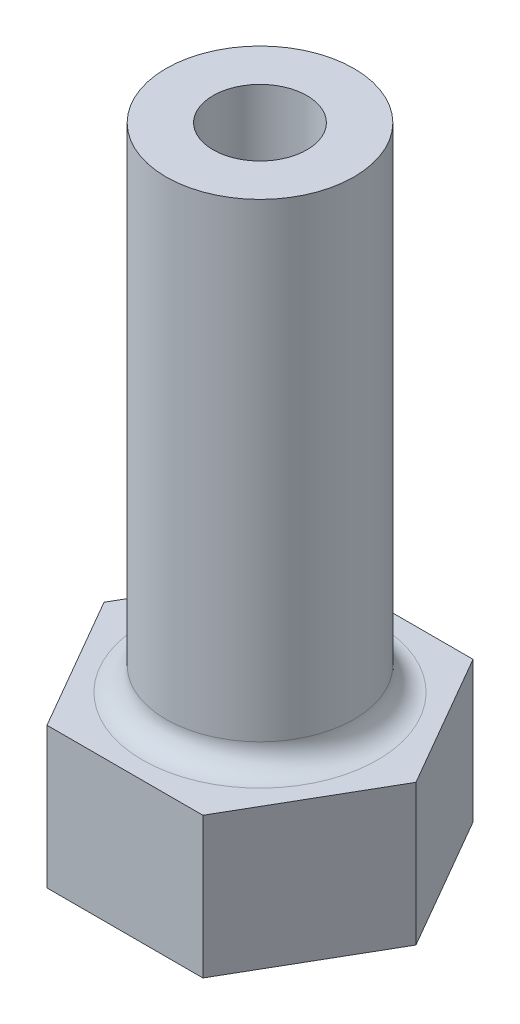
ISO-10303-21;
HEADER;
FILE_DESCRIPTION(('STEP AP214'),'2;1');
FILE_NAME('part.step','',(''),(''),'','','');
FILE_SCHEMA(('AUTOMOTIVE_DESIGN { 1 0 10303 214 1 1 1 1 }'));
ENDSEC;
DATA;
#1=APPLICATION_CONTEXT('core data for automotive mechanical design processes');
#2=APPLICATION_PROTOCOL_DEFINITION('international standard','automotive_design',2000,#1);
#3=PRODUCT_CONTEXT('',#1,'mechanical');
#4=PRODUCT('Part','Part','',(#3));
#5=PRODUCT_RELATED_PRODUCT_CATEGORY('part','',(#4));
#6=PRODUCT_DEFINITION_FORMATION('','',#4);
#7=PRODUCT_DEFINITION_CONTEXT('part definition',#1,'design');
#8=PRODUCT_DEFINITION('design','',#6,#7);
#9=PRODUCT_DEFINITION_SHAPE('','',#8);
#10=(LENGTH_UNIT() NAMED_UNIT(*) SI_UNIT(.MILLI.,.METRE.));
#11=(NAMED_UNIT(*) PLANE_ANGLE_UNIT() SI_UNIT($,.RADIAN.));
#12=(NAMED_UNIT(*) SI_UNIT($,.STERADIAN.) SOLID_ANGLE_UNIT());
#13=UNCERTAINTY_MEASURE_WITH_UNIT(LENGTH_MEASURE(1.E-05),#10,'distance_accuracy_value','');
#14=(GEOMETRIC_REPRESENTATION_CONTEXT(3) GLOBAL_UNCERTAINTY_ASSIGNED_CONTEXT((#13)) GLOBAL_UNIT_ASSIGNED_CONTEXT((#10,
#11,#12)) REPRESENTATION_CONTEXT('',''));
#15=CARTESIAN_POINT('',(0.,0.,0.));
#16=DIRECTION('',(0.,0.,1.));
#17=DIRECTION('',(1.,0.,0.));
#18=AXIS2_PLACEMENT_3D('',#15,#16,#17);
#19=CARTESIAN_POINT('',(0.,27.,0.));
#20=DIRECTION('',(0.,-1.,0.));
#21=DIRECTION('',(0.,0.,-1.));
#22=AXIS2_PLACEMENT_3D('',#19,#20,#21);
#23=CYLINDRICAL_SURFACE('',#22,4.);
#24=CARTESIAN_POINT('',(0.,7.,0.));
#25=DIRECTION('',(0.,1.,0.));
#26=DIRECTION('',(0.,0.,1.));
#27=AXIS2_PLACEMENT_3D('',#24,#25,#26);
#28=CIRCLE('',#27,4.);
#29=CARTESIAN_POINT('',(0.,7.,4.));
#30=VERTEX_POINT('',#29);
#31=EDGE_CURVE('E51',#30,#30,#28,.T.);
#32=ORIENTED_EDGE('',*,*,#31,.T.);
#33=EDGE_LOOP('',(#32));
#34=FACE_BOUND('',#33,.T.);
#35=CARTESIAN_POINT('',(0.,27.,0.));
#36=DIRECTION('',(0.,1.,0.));
#37=DIRECTION('',(0.,0.,1.));
#38=AXIS2_PLACEMENT_3D('',#35,#36,#37);
#39=CIRCLE('',#38,4.);
#40=CARTESIAN_POINT('',(0.,27.,4.));
#41=VERTEX_POINT('',#40);
#42=EDGE_CURVE('E147',#41,#41,#39,.T.);
#43=ORIENTED_EDGE('',*,*,#42,.F.);
#44=EDGE_LOOP('',(#43));
#45=FACE_BOUND('',#44,.T.);
#46=ADVANCED_FACE('F41',(#34,#45),#23,.T.);
#47=CARTESIAN_POINT('',(0.,27.,0.));
#48=DIRECTION('',(0.,1.,0.));
#49=DIRECTION('',(0.,0.,1.));
#50=AXIS2_PLACEMENT_3D('',#47,#48,#49);
#51=PLANE('',#50);
#52=CARTESIAN_POINT('',(0.,27.,0.));
#53=DIRECTION('',(0.,1.,0.));
#54=DIRECTION('',(0.,0.,1.));
#55=AXIS2_PLACEMENT_3D('',#52,#53,#54);
#56=CIRCLE('',#55,2.);
#57=CARTESIAN_POINT('',(0.,27.,2.));
#58=VERTEX_POINT('',#57);
#59=EDGE_CURVE('E275',#58,#58,#56,.T.);
#60=ORIENTED_EDGE('',*,*,#59,.F.);
#61=EDGE_LOOP('',(#60));
#62=FACE_BOUND('',#61,.T.);
#63=ORIENTED_EDGE('',*,*,#42,.T.);
#64=EDGE_LOOP('',(#63));
#65=FACE_BOUND('',#64,.T.);
#66=ADVANCED_FACE('F172',(#62,#65),#51,.T.);
#67=CARTESIAN_POINT('',(0.,6.,0.));
#68=DIRECTION('',(0.,1.,0.));
#69=DIRECTION('',(0.,0.,1.));
#70=AXIS2_PLACEMENT_3D('',#67,#68,#69);
#71=PLANE('',#70);
#72=CARTESIAN_POINT('',(0.,6.,0.));
#73=DIRECTION('',(0.,1.,0.));
#74=DIRECTION('',(0.,0.,1.));
#75=AXIS2_PLACEMENT_3D('',#72,#73,#74);
#76=CIRCLE('',#75,5.);
#77=CARTESIAN_POINT('',(0.,6.,5.));
#78=VERTEX_POINT('',#77);
#79=EDGE_CURVE('E11',#78,#78,#76,.F.);
#80=ORIENTED_EDGE('',*,*,#79,.T.);
#81=EDGE_LOOP('',(#80));
#82=FACE_BOUND('',#81,.T.);
#83=DIRECTION('',(0.5,0.,-0.866025403784439));
#84=VECTOR('',#83,1.);
#85=CARTESIAN_POINT('',(3.31976404784035,6.,5.75));
#86=LINE('',#85,#84);
#87=CARTESIAN_POINT('',(3.31976404784035,6.,5.75));
#88=VERTEX_POINT('',#87);
#89=CARTESIAN_POINT('',(6.6395280956807,6.,0.));
#90=VERTEX_POINT('',#89);
#91=EDGE_CURVE('E138',#88,#90,#86,.T.);
#92=ORIENTED_EDGE('',*,*,#91,.T.);
#93=DIRECTION('',(-0.5,0.,-0.866025403784439));
#94=VECTOR('',#93,1.);
#95=CARTESIAN_POINT('',(6.6395280956807,6.,0.));
#96=LINE('',#95,#94);
#97=CARTESIAN_POINT('',(3.31976404784035,6.,-5.75));
#98=VERTEX_POINT('',#97);
#99=EDGE_CURVE('E97',#90,#98,#96,.T.);
#100=ORIENTED_EDGE('',*,*,#99,.T.);
#101=DIRECTION('',(-1.,0.,0.));
#102=VECTOR('',#101,1.);
#103=CARTESIAN_POINT('',(3.31976404784035,6.,-5.75));
#104=LINE('',#103,#102);
#105=CARTESIAN_POINT('',(-3.31976404784035,6.,-5.75));
#106=VERTEX_POINT('',#105);
#107=EDGE_CURVE('E110',#98,#106,#104,.T.);
#108=ORIENTED_EDGE('',*,*,#107,.T.);
#109=DIRECTION('',(-0.5,0.,0.866025403784439));
#110=VECTOR('',#109,1.);
#111=CARTESIAN_POINT('',(-3.31976404784035,6.,-5.75));
#112=LINE('',#111,#110);
#113=CARTESIAN_POINT('',(-6.6395280956807,6.,0.));
#114=VERTEX_POINT('',#113);
#115=EDGE_CURVE('E104',#106,#114,#112,.T.);
#116=ORIENTED_EDGE('',*,*,#115,.T.);
#117=DIRECTION('',(0.5,0.,0.866025403784438));
#118=VECTOR('',#117,1.);
#119=CARTESIAN_POINT('',(-6.6395280956807,6.,0.));
#120=LINE('',#119,#118);
#121=CARTESIAN_POINT('',(-3.31976404784035,6.,5.75));
#122=VERTEX_POINT('',#121);
#123=EDGE_CURVE('E108',#114,#122,#120,.T.);
#124=ORIENTED_EDGE('',*,*,#123,.T.);
#125=DIRECTION('',(1.,0.,0.));
#126=VECTOR('',#125,1.);
#127=CARTESIAN_POINT('',(-3.31976404784035,6.,5.75));
#128=LINE('',#127,#126);
#129=EDGE_CURVE('E59',#122,#88,#128,.T.);
#130=ORIENTED_EDGE('',*,*,#129,.T.);
#131=EDGE_LOOP('',(#92,#100,#108,#116,#124,#130));
#132=FACE_BOUND('',#131,.T.);
#133=ADVANCED_FACE('F106',(#82,#132),#71,.T.);
#134=CARTESIAN_POINT('',(3.31976404784035,6.,5.75));
#135=DIRECTION('',(-0.866025403784438,0.,-0.5));
#136=DIRECTION('',(-0.5,0.,0.866025403784439));
#137=AXIS2_PLACEMENT_3D('',#134,#135,#136);
#138=PLANE('',#137);
#139=DIRECTION('',(0.5,0.,-0.866025403784439));
#140=VECTOR('',#139,1.);
#141=CARTESIAN_POINT('',(3.31976404784035,0.,5.75));
#142=LINE('',#141,#140);
#143=CARTESIAN_POINT('',(3.31976404784035,0.,5.75));
#144=VERTEX_POINT('',#143);
#145=CARTESIAN_POINT('',(6.6395280956807,0.,0.));
#146=VERTEX_POINT('',#145);
#147=EDGE_CURVE('E128',#144,#146,#142,.T.);
#148=ORIENTED_EDGE('',*,*,#147,.T.);
#149=DIRECTION('',(0.,-1.,0.));
#150=VECTOR('',#149,1.);
#151=CARTESIAN_POINT('',(6.6395280956807,6.,0.));
#152=LINE('',#151,#150);
#153=EDGE_CURVE('E145',#90,#146,#152,.T.);
#154=ORIENTED_EDGE('',*,*,#153,.F.);
#155=ORIENTED_EDGE('',*,*,#91,.F.);
#156=DIRECTION('',(0.,-1.,0.));
#157=VECTOR('',#156,1.);
#158=CARTESIAN_POINT('',(3.31976404784035,6.,5.75));
#159=LINE('',#158,#157);
#160=EDGE_CURVE('E124',#88,#144,#159,.T.);
#161=ORIENTED_EDGE('',*,*,#160,.T.);
#162=EDGE_LOOP('',(#148,#154,#155,#161));
#163=FACE_BOUND('',#162,.T.);
#164=ADVANCED_FACE('F179',(#163),#138,.F.);
#165=CARTESIAN_POINT('',(6.6395280956807,6.,0.));
#166=DIRECTION('',(-0.866025403784438,0.,0.5));
#167=DIRECTION('',(0.5,0.,0.866025403784439));
#168=AXIS2_PLACEMENT_3D('',#165,#166,#167);
#169=PLANE('',#168);
#170=DIRECTION('',(-0.5,0.,-0.866025403784439));
#171=VECTOR('',#170,1.);
#172=CARTESIAN_POINT('',(6.6395280956807,0.,0.));
#173=LINE('',#172,#171);
#174=CARTESIAN_POINT('',(3.31976404784035,0.,-5.75));
#175=VERTEX_POINT('',#174);
#176=EDGE_CURVE('E131',#146,#175,#173,.T.);
#177=ORIENTED_EDGE('',*,*,#176,.T.);
#178=DIRECTION('',(0.,-1.,0.));
#179=VECTOR('',#178,1.);
#180=CARTESIAN_POINT('',(3.31976404784035,6.,-5.75));
#181=LINE('',#180,#179);
#182=EDGE_CURVE('E142',#98,#175,#181,.T.);
#183=ORIENTED_EDGE('',*,*,#182,.F.);
#184=ORIENTED_EDGE('',*,*,#99,.F.);
#185=ORIENTED_EDGE('',*,*,#153,.T.);
#186=EDGE_LOOP('',(#177,#183,#184,#185));
#187=FACE_BOUND('',#186,.T.);
#188=ADVANCED_FACE('F182',(#187),#169,.F.);
#189=CARTESIAN_POINT('',(3.31976404784035,6.,-5.75));
#190=DIRECTION('',(0.,0.,1.));
#191=DIRECTION('',(1.,0.,0.));
#192=AXIS2_PLACEMENT_3D('',#189,#190,#191);
#193=PLANE('',#192);
#194=DIRECTION('',(-1.,0.,0.));
#195=VECTOR('',#194,1.);
#196=CARTESIAN_POINT('',(3.31976404784035,0.,-5.75));
#197=LINE('',#196,#195);
#198=CARTESIAN_POINT('',(-3.31976404784035,0.,-5.75));
#199=VERTEX_POINT('',#198);
#200=EDGE_CURVE('E133',#175,#199,#197,.T.);
#201=ORIENTED_EDGE('',*,*,#200,.T.);
#202=DIRECTION('',(0.,-1.,0.));
#203=VECTOR('',#202,1.);
#204=CARTESIAN_POINT('',(-3.31976404784035,6.,-5.75));
#205=LINE('',#204,#203);
#206=EDGE_CURVE('E119',#106,#199,#205,.T.);
#207=ORIENTED_EDGE('',*,*,#206,.F.);
#208=ORIENTED_EDGE('',*,*,#107,.F.);
#209=ORIENTED_EDGE('',*,*,#182,.T.);
#210=EDGE_LOOP('',(#201,#207,#208,#209));
#211=FACE_BOUND('',#210,.T.);
#212=ADVANCED_FACE('F186',(#211),#193,.F.);
#213=CARTESIAN_POINT('',(-3.31976404784035,6.,-5.75));
#214=DIRECTION('',(0.866025403784439,0.,0.5));
#215=DIRECTION('',(0.5,0.,-0.866025403784439));
#216=AXIS2_PLACEMENT_3D('',#213,#214,#215);
#217=PLANE('',#216);
#218=DIRECTION('',(-0.5,0.,0.866025403784439));
#219=VECTOR('',#218,1.);
#220=CARTESIAN_POINT('',(-3.31976404784035,0.,-5.75));
#221=LINE('',#220,#219);
#222=CARTESIAN_POINT('',(-6.6395280956807,0.,0.));
#223=VERTEX_POINT('',#222);
#224=EDGE_CURVE('E118',#199,#223,#221,.T.);
#225=ORIENTED_EDGE('',*,*,#224,.T.);
#226=DIRECTION('',(0.,-1.,0.));
#227=VECTOR('',#226,1.);
#228=CARTESIAN_POINT('',(-6.6395280956807,6.,0.));
#229=LINE('',#228,#227);
#230=EDGE_CURVE('E115',#114,#223,#229,.T.);
#231=ORIENTED_EDGE('',*,*,#230,.F.);
#232=ORIENTED_EDGE('',*,*,#115,.F.);
#233=ORIENTED_EDGE('',*,*,#206,.T.);
#234=EDGE_LOOP('',(#225,#231,#232,#233));
#235=FACE_BOUND('',#234,.T.);
#236=ADVANCED_FACE('F116',(#235),#217,.F.);
#237=CARTESIAN_POINT('',(-6.6395280956807,6.,0.));
#238=DIRECTION('',(0.866025403784438,0.,-0.5));
#239=DIRECTION('',(-0.5,0.,-0.866025403784438));
#240=AXIS2_PLACEMENT_3D('',#237,#238,#239);
#241=PLANE('',#240);
#242=DIRECTION('',(0.5,0.,0.866025403784438));
#243=VECTOR('',#242,1.);
#244=CARTESIAN_POINT('',(-6.6395280956807,0.,0.));
#245=LINE('',#244,#243);
#246=CARTESIAN_POINT('',(-3.31976404784035,0.,5.75));
#247=VERTEX_POINT('',#246);
#248=EDGE_CURVE('E82',#223,#247,#245,.T.);
#249=ORIENTED_EDGE('',*,*,#248,.T.);
#250=DIRECTION('',(0.,-1.,0.));
#251=VECTOR('',#250,1.);
#252=CARTESIAN_POINT('',(-3.31976404784035,6.,5.75));
#253=LINE('',#252,#251);
#254=EDGE_CURVE('E120',#122,#247,#253,.T.);
#255=ORIENTED_EDGE('',*,*,#254,.F.);
#256=ORIENTED_EDGE('',*,*,#123,.F.);
#257=ORIENTED_EDGE('',*,*,#230,.T.);
#258=EDGE_LOOP('',(#249,#255,#256,#257));
#259=FACE_BOUND('',#258,.T.);
#260=ADVANCED_FACE('F122',(#259),#241,.F.);
#261=CARTESIAN_POINT('',(-3.31976404784035,6.,5.75));
#262=DIRECTION('',(0.,0.,-1.));
#263=DIRECTION('',(-1.,0.,0.));
#264=AXIS2_PLACEMENT_3D('',#261,#262,#263);
#265=PLANE('',#264);
#266=DIRECTION('',(1.,0.,0.));
#267=VECTOR('',#266,1.);
#268=CARTESIAN_POINT('',(-3.31976404784035,0.,5.75));
#269=LINE('',#268,#267);
#270=EDGE_CURVE('E88',#247,#144,#269,.T.);
#271=ORIENTED_EDGE('',*,*,#270,.T.);
#272=ORIENTED_EDGE('',*,*,#160,.F.);
#273=ORIENTED_EDGE('',*,*,#129,.F.);
#274=ORIENTED_EDGE('',*,*,#254,.T.);
#275=EDGE_LOOP('',(#271,#272,#273,#274));
#276=FACE_BOUND('',#275,.T.);
#277=ADVANCED_FACE('F167',(#276),#265,.F.);
#278=CARTESIAN_POINT('',(0.,0.,0.));
#279=DIRECTION('',(0.,1.,0.));
#280=DIRECTION('',(0.,0.,1.));
#281=AXIS2_PLACEMENT_3D('',#278,#279,#280);
#282=PLANE('',#281);
#283=CARTESIAN_POINT('',(0.,0.,0.));
#284=DIRECTION('',(0.,1.,0.));
#285=DIRECTION('',(0.,0.,1.));
#286=AXIS2_PLACEMENT_3D('',#283,#284,#285);
#287=CIRCLE('',#286,2.);
#288=CARTESIAN_POINT('',(0.,0.,2.));
#289=VERTEX_POINT('',#288);
#290=EDGE_CURVE('E45',#289,#289,#287,.T.);
#291=ORIENTED_EDGE('',*,*,#290,.T.);
#292=EDGE_LOOP('',(#291));
#293=FACE_BOUND('',#292,.T.);
#294=ORIENTED_EDGE('',*,*,#147,.F.);
#295=ORIENTED_EDGE('',*,*,#270,.F.);
#296=ORIENTED_EDGE('',*,*,#248,.F.);
#297=ORIENTED_EDGE('',*,*,#224,.F.);
#298=ORIENTED_EDGE('',*,*,#200,.F.);
#299=ORIENTED_EDGE('',*,*,#176,.F.);
#300=EDGE_LOOP('',(#294,#295,#296,#297,#298,#299));
#301=FACE_BOUND('',#300,.T.);
#302=ADVANCED_FACE('F157',(#293,#301),#282,.F.);
#303=CARTESIAN_POINT('',(0.,7.,0.));
#304=DIRECTION('',(0.,1.,0.));
#305=DIRECTION('',(0.,0.,1.));
#306=AXIS2_PLACEMENT_3D('',#303,#304,#305);
#307=TOROIDAL_SURFACE('',#306,5.,1.);
#308=ORIENTED_EDGE('',*,*,#79,.F.);
#309=EDGE_LOOP('',(#308));
#310=FACE_BOUND('',#309,.T.);
#311=ORIENTED_EDGE('',*,*,#31,.F.);
#312=EDGE_LOOP('',(#311));
#313=FACE_BOUND('',#312,.T.);
#314=ADVANCED_FACE('F43',(#310,#313),#307,.F.);
#315=CARTESIAN_POINT('',(0.,-1.2E-05,0.));
#316=DIRECTION('',(0.,1.,0.));
#317=DIRECTION('',(0.,0.,1.));
#318=AXIS2_PLACEMENT_3D('',#315,#316,#317);
#319=CYLINDRICAL_SURFACE('',#318,2.);
#320=CARTESIAN_POINT('',(0.,27.,2.));
#321=CARTESIAN_POINT('',(0.,26.71875,2.));
#322=CARTESIAN_POINT('',(0.,26.4375,2.));
#323=CARTESIAN_POINT('',(0.,25.875,2.));
#324=CARTESIAN_POINT('',(0.,25.59375,2.));
#325=CARTESIAN_POINT('',(0.,25.03125,2.));
#326=CARTESIAN_POINT('',(0.,24.75,2.));
#327=CARTESIAN_POINT('',(0.,24.1875,2.));
#328=CARTESIAN_POINT('',(0.,23.90625,2.));
#329=CARTESIAN_POINT('',(0.,23.34375,2.));
#330=CARTESIAN_POINT('',(0.,23.0625,2.));
#331=CARTESIAN_POINT('',(0.,22.5,2.));
#332=CARTESIAN_POINT('',(0.,22.21875,2.));
#333=CARTESIAN_POINT('',(0.,21.65625,2.));
#334=CARTESIAN_POINT('',(0.,21.375,2.));
#335=CARTESIAN_POINT('',(0.,20.8125,2.));
#336=CARTESIAN_POINT('',(0.,20.53125,2.));
#337=CARTESIAN_POINT('',(0.,19.96875,2.));
#338=CARTESIAN_POINT('',(0.,19.6875,2.));
#339=CARTESIAN_POINT('',(0.,19.125,2.));
#340=CARTESIAN_POINT('',(0.,18.84375,2.));
#341=CARTESIAN_POINT('',(0.,18.28125,2.));
#342=CARTESIAN_POINT('',(0.,18.,2.));
#343=CARTESIAN_POINT('',(0.,17.4375,2.));
#344=CARTESIAN_POINT('',(0.,17.15625,2.));
#345=CARTESIAN_POINT('',(0.,16.59375,2.));
#346=CARTESIAN_POINT('',(0.,16.3125,2.));
#347=CARTESIAN_POINT('',(0.,15.75,2.));
#348=CARTESIAN_POINT('',(0.,15.46875,2.));
#349=CARTESIAN_POINT('',(0.,14.90625,2.));
#350=CARTESIAN_POINT('',(0.,14.625,2.));
#351=CARTESIAN_POINT('',(0.,14.0625,2.));
#352=CARTESIAN_POINT('',(0.,13.78125,2.));
#353=CARTESIAN_POINT('',(0.,13.21875,2.));
#354=CARTESIAN_POINT('',(0.,12.9375,2.));
#355=CARTESIAN_POINT('',(0.,12.375,2.));
#356=CARTESIAN_POINT('',(0.,12.09375,2.));
#357=CARTESIAN_POINT('',(0.,11.53125,2.));
#358=CARTESIAN_POINT('',(0.,11.25,2.));
#359=CARTESIAN_POINT('',(0.,10.6875,2.));
#360=CARTESIAN_POINT('',(0.,10.40625,2.));
#361=CARTESIAN_POINT('',(0.,9.84375,2.));
#362=CARTESIAN_POINT('',(0.,9.5625,2.));
#363=CARTESIAN_POINT('',(0.,9.,2.));
#364=CARTESIAN_POINT('',(0.,8.71875,2.));
#365=CARTESIAN_POINT('',(0.,8.15625,2.));
#366=CARTESIAN_POINT('',(0.,7.875,2.));
#367=CARTESIAN_POINT('',(0.,7.3125,2.));
#368=CARTESIAN_POINT('',(0.,7.03125,2.));
#369=CARTESIAN_POINT('',(0.,6.46875,2.));
#370=CARTESIAN_POINT('',(0.,6.1875,2.));
#371=CARTESIAN_POINT('',(0.,5.625,2.));
#372=CARTESIAN_POINT('',(0.,5.34375,2.));
#373=CARTESIAN_POINT('',(0.,4.78125,2.));
#374=CARTESIAN_POINT('',(0.,4.5,2.));
#375=CARTESIAN_POINT('',(0.,3.9375,2.));
#376=CARTESIAN_POINT('',(0.,3.65625,2.));
#377=CARTESIAN_POINT('',(0.,3.09375,2.));
#378=CARTESIAN_POINT('',(0.,2.8125,2.));
#379=CARTESIAN_POINT('',(0.,2.25,2.));
#380=CARTESIAN_POINT('',(0.,1.96875,2.));
#381=CARTESIAN_POINT('',(0.,1.40625,2.));
#382=CARTESIAN_POINT('',(0.,1.125,2.));
#383=CARTESIAN_POINT('',(0.,0.562500000000001,2.));
#384=CARTESIAN_POINT('',(0.,0.281250000000001,2.));
#385=CARTESIAN_POINT('',(0.,0.,2.));
#386=B_SPLINE_CURVE_WITH_KNOTS('',3,(#320,#321,#322,#323,#324,#325,#326,#327,#328,#329,#330,
#331,#332,#333,#334,#335,#336,#337,#338,#339,#340,#341,#342,#343,#344,#345,#346,#347,#348,#349,
#350,#351,#352,#353,#354,#355,#356,#357,#358,#359,#360,#361,#362,#363,#364,#365,#366,#367,#368,
#369,#370,#371,#372,#373,#374,#375,#376,#377,#378,#379,#380,#381,#382,#383,#384,#385),
.UNSPECIFIED.,.F.,.F.,(4,2,2,2,2,2,2,2,2,2,2,2,2,2,2,2,2,2,2,2,2,2,2,2,2,2,2,2,2,2,2,2,4),(0.,
0.843750000000001,1.6875,2.53125,3.375,4.21875,5.0625,5.90625,6.75,7.59375,8.4375,9.28125,
10.125,10.96875,11.8125,12.65625,13.5,14.34375,15.1875,16.03125,16.875,17.71875,18.5625,
19.40625,20.25,21.09375,21.9375,22.78125,23.625,24.46875,25.3125,26.15625,27.),.UNSPECIFIED.);
#387=EDGE_CURVE('BSEAM156',#58,#289,#386,.T.);
#388=ORIENTED_EDGE('',*,*,#59,.T.);
#389=ORIENTED_EDGE('',*,*,#290,.F.);
#390=ORIENTED_EDGE('',*,*,#387,.T.);
#391=ORIENTED_EDGE('',*,*,#387,.F.);
#392=EDGE_LOOP('',(#388,#390,#389,#391));
#393=FACE_BOUND('',#392,.T.);
#394=ADVANCED_FACE('F156',(#393),#319,.F.);
#395=CLOSED_SHELL('',(#46,#66,#133,#164,#188,#212,#236,#260,#277,#302,#314,#394));
#396=MANIFOLD_SOLID_BREP('B2',#395);
#397=ADVANCED_BREP_SHAPE_REPRESENTATION('',(#18,#396),#14);
#398=SHAPE_DEFINITION_REPRESENTATION(#9,#397);
ENDSEC;
END-ISO-10303-21;
